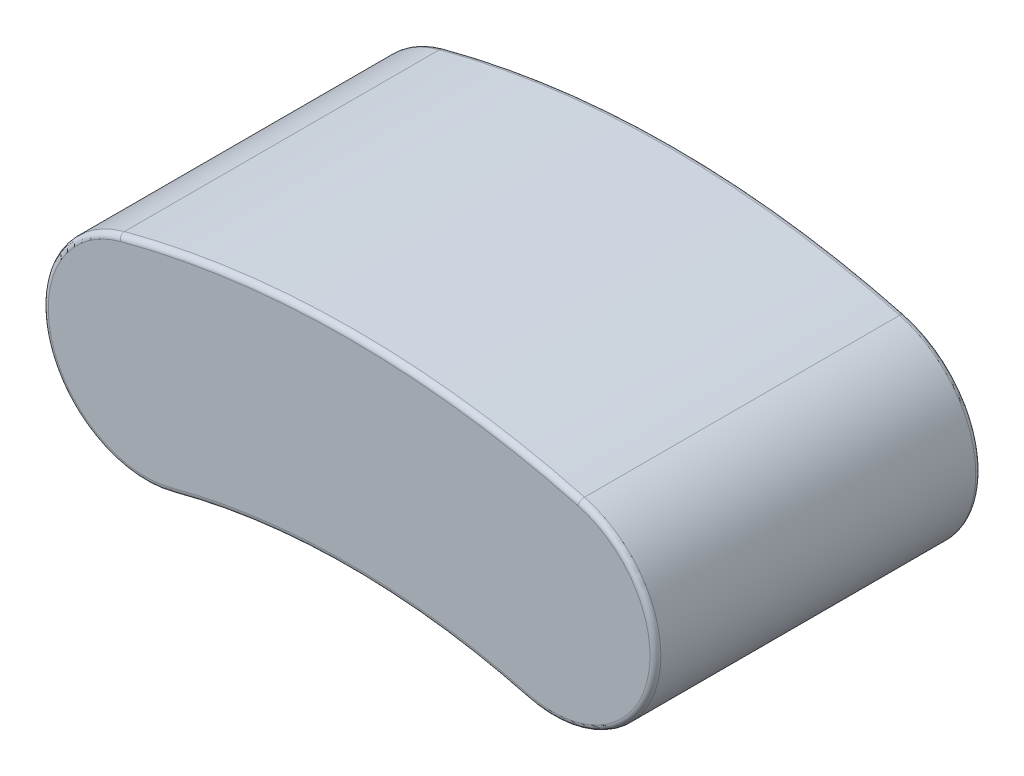
ISO-10303-21;
HEADER;
FILE_DESCRIPTION(('STEP AP214'),'2;1');
FILE_NAME('part.step','',(''),(''),'','','');
FILE_SCHEMA(('AUTOMOTIVE_DESIGN { 1 0 10303 214 1 1 1 1 }'));
ENDSEC;
DATA;
#1=APPLICATION_CONTEXT('core data for automotive mechanical design processes');
#2=APPLICATION_PROTOCOL_DEFINITION('international standard','automotive_design',2000,#1);
#3=PRODUCT_CONTEXT('',#1,'mechanical');
#4=PRODUCT('Part','Part','',(#3));
#5=PRODUCT_RELATED_PRODUCT_CATEGORY('part','',(#4));
#6=PRODUCT_DEFINITION_FORMATION('','',#4);
#7=PRODUCT_DEFINITION_CONTEXT('part definition',#1,'design');
#8=PRODUCT_DEFINITION('design','',#6,#7);
#9=PRODUCT_DEFINITION_SHAPE('','',#8);
#10=(LENGTH_UNIT() NAMED_UNIT(*) SI_UNIT(.MILLI.,.METRE.));
#11=(NAMED_UNIT(*) PLANE_ANGLE_UNIT() SI_UNIT($,.RADIAN.));
#12=(NAMED_UNIT(*) SI_UNIT($,.STERADIAN.) SOLID_ANGLE_UNIT());
#13=UNCERTAINTY_MEASURE_WITH_UNIT(LENGTH_MEASURE(1.E-05),#10,'distance_accuracy_value','');
#14=(GEOMETRIC_REPRESENTATION_CONTEXT(3) GLOBAL_UNCERTAINTY_ASSIGNED_CONTEXT((#13)) GLOBAL_UNIT_ASSIGNED_CONTEXT((#10,
#11,#12)) REPRESENTATION_CONTEXT('',''));
#15=CARTESIAN_POINT('',(0.,0.,0.));
#16=DIRECTION('',(0.,0.,1.));
#17=DIRECTION('',(1.,0.,0.));
#18=AXIS2_PLACEMENT_3D('',#15,#16,#17);
#19=CARTESIAN_POINT('',(37.5,-150.648630181845,0.));
#20=DIRECTION('',(0.,0.,1.));
#21=DIRECTION('',(1.,0.,0.));
#22=AXIS2_PLACEMENT_3D('',#19,#20,#21);
#23=PLANE('',#22);
#24=CARTESIAN_POINT('',(0.,-291.483111090051,0.));
#25=DIRECTION('',(0.,0.,1.));
#26=DIRECTION('',(1.,0.,0.));
#27=AXIS2_PLACEMENT_3D('',#24,#25,#26);
#28=CIRCLE('',#27,327.312940209081);
#29=CARTESIAN_POINT('',(-84.2191865726898,24.8093002026451,0.));
#30=VERTEX_POINT('',#29);
#31=CARTESIAN_POINT('',(84.2191865726898,24.8093002026452,0.));
#32=VERTEX_POINT('',#31);
#33=EDGE_CURVE('E203',#30,#32,#28,.F.);
#34=ORIENTED_EDGE('',*,*,#33,.T.);
#35=CARTESIAN_POINT('',(75.,-9.81414927363925,0.));
#36=DIRECTION('',(0.,0.,1.));
#37=DIRECTION('',(1.,0.,0.));
#38=AXIS2_PLACEMENT_3D('',#35,#36,#37);
#39=CIRCLE('',#38,35.8298291190299);
#40=CARTESIAN_POINT('',(65.7808134273102,-44.4375987499236,0.));
#41=VERTEX_POINT('',#40);
#42=EDGE_CURVE('E209',#32,#41,#39,.F.);
#43=ORIENTED_EDGE('',*,*,#42,.T.);
#44=CARTESIAN_POINT('',(0.,-291.483111090051,0.));
#45=DIRECTION('',(0.,0.,1.));
#46=DIRECTION('',(1.,0.,0.));
#47=AXIS2_PLACEMENT_3D('',#44,#45,#46);
#48=CIRCLE('',#47,255.653281971021);
#49=CARTESIAN_POINT('',(-65.7808134273102,-44.4375987499237,0.));
#50=VERTEX_POINT('',#49);
#51=EDGE_CURVE('E207',#41,#50,#48,.T.);
#52=ORIENTED_EDGE('',*,*,#51,.T.);
#53=CARTESIAN_POINT('',(-75.,-9.81414927363925,0.));
#54=DIRECTION('',(0.,0.,1.));
#55=DIRECTION('',(1.,0.,0.));
#56=AXIS2_PLACEMENT_3D('',#53,#54,#55);
#57=CIRCLE('',#56,35.8298291190299);
#58=EDGE_CURVE('E205',#50,#30,#57,.F.);
#59=ORIENTED_EDGE('',*,*,#58,.T.);
#60=EDGE_LOOP('',(#34,#43,#52,#59));
#61=FACE_BOUND('',#60,.T.);
#62=CARTESIAN_POINT('',(75.,-9.81414927363925,0.));
#63=DIRECTION('',(0.,0.,1.));
#64=DIRECTION('',(1.,0.,0.));
#65=AXIS2_PLACEMENT_3D('',#62,#63,#64);
#66=CIRCLE('',#65,34.8298291190299);
#67=CARTESIAN_POINT('',(83.9618817850487,23.8429699039083,0.));
#68=VERTEX_POINT('',#67);
#69=CARTESIAN_POINT('',(66.0381182149514,-43.4712684511867,0.));
#70=VERTEX_POINT('',#69);
#71=EDGE_CURVE('E134',#68,#70,#66,.F.);
#72=ORIENTED_EDGE('',*,*,#71,.F.);
#73=CARTESIAN_POINT('',(0.,-291.483111090051,0.));
#74=DIRECTION('',(0.,0.,1.));
#75=DIRECTION('',(1.,0.,0.));
#76=AXIS2_PLACEMENT_3D('',#73,#74,#75);
#77=CIRCLE('',#76,326.312940209081);
#78=CARTESIAN_POINT('',(-83.9618817850486,23.8429699039082,0.));
#79=VERTEX_POINT('',#78);
#80=EDGE_CURVE('E150',#68,#79,#77,.T.);
#81=ORIENTED_EDGE('',*,*,#80,.T.);
#82=CARTESIAN_POINT('',(-75.,-9.81414927363925,0.));
#83=DIRECTION('',(0.,0.,1.));
#84=DIRECTION('',(1.,0.,0.));
#85=AXIS2_PLACEMENT_3D('',#82,#83,#84);
#86=CIRCLE('',#85,34.8298291190299);
#87=CARTESIAN_POINT('',(-66.0381182149514,-43.4712684511867,0.));
#88=VERTEX_POINT('',#87);
#89=EDGE_CURVE('E157',#88,#79,#86,.F.);
#90=ORIENTED_EDGE('',*,*,#89,.F.);
#91=CARTESIAN_POINT('',(0.,-291.483111090051,0.));
#92=DIRECTION('',(0.,0.,1.));
#93=DIRECTION('',(1.,0.,0.));
#94=AXIS2_PLACEMENT_3D('',#91,#92,#93);
#95=CIRCLE('',#94,256.653281971021);
#96=EDGE_CURVE('E155',#70,#88,#95,.T.);
#97=ORIENTED_EDGE('',*,*,#96,.F.);
#98=EDGE_LOOP('',(#72,#81,#90,#97));
#99=FACE_BOUND('',#98,.T.);
#100=ADVANCED_FACE('F37',(#61,#99),#23,.F.);
#101=CARTESIAN_POINT('',(75.,-9.81414927363925,120.));
#102=DIRECTION('',(0.,0.,-1.));
#103=DIRECTION('',(-1.,0.,0.));
#104=AXIS2_PLACEMENT_3D('',#101,#102,#103);
#105=CYLINDRICAL_SURFACE('',#104,37.8298291190299);
#106=DIRECTION('',(0.,0.,-1.));
#107=VECTOR('',#106,1.);
#108=CARTESIAN_POINT('',(65.266203852028,-46.3702593473974,120.));
#109=LINE('',#108,#107);
#110=CARTESIAN_POINT('',(65.266203852028,-46.3702593473974,118.));
#111=VERTEX_POINT('',#110);
#112=CARTESIAN_POINT('',(65.266203852028,-46.3702593473974,2.));
#113=VERTEX_POINT('',#112);
#114=EDGE_CURVE('E162',#111,#113,#109,.T.);
#115=ORIENTED_EDGE('',*,*,#114,.T.);
#116=CARTESIAN_POINT('',(75.,-9.81414927363925,2.));
#117=DIRECTION('',(0.,0.,1.));
#118=DIRECTION('',(1.,0.,0.));
#119=AXIS2_PLACEMENT_3D('',#116,#117,#118);
#120=CIRCLE('',#119,37.8298291190299);
#121=CARTESIAN_POINT('',(84.733796147972,26.741960800119,2.));
#122=VERTEX_POINT('',#121);
#123=EDGE_CURVE('E191',#113,#122,#120,.T.);
#124=ORIENTED_EDGE('',*,*,#123,.T.);
#125=DIRECTION('',(0.,0.,-1.));
#126=VECTOR('',#125,1.);
#127=CARTESIAN_POINT('',(84.733796147972,26.741960800119,120.));
#128=LINE('',#127,#126);
#129=CARTESIAN_POINT('',(84.733796147972,26.741960800119,118.));
#130=VERTEX_POINT('',#129);
#131=EDGE_CURVE('E171',#130,#122,#128,.T.);
#132=ORIENTED_EDGE('',*,*,#131,.F.);
#133=CARTESIAN_POINT('',(75.,-9.81414927363925,118.));
#134=DIRECTION('',(0.,0.,1.));
#135=DIRECTION('',(1.,0.,0.));
#136=AXIS2_PLACEMENT_3D('',#133,#134,#135);
#137=CIRCLE('',#136,37.8298291190299);
#138=EDGE_CURVE('E182',#130,#111,#137,.F.);
#139=ORIENTED_EDGE('',*,*,#138,.T.);
#140=EDGE_LOOP('',(#115,#124,#132,#139));
#141=FACE_BOUND('',#140,.T.);
#142=ADVANCED_FACE('F242',(#141),#105,.T.);
#143=CARTESIAN_POINT('',(0.,-291.483111090051,120.));
#144=DIRECTION('',(0.,0.,-1.));
#145=DIRECTION('',(-1.,0.,0.));
#146=AXIS2_PLACEMENT_3D('',#143,#144,#145);
#147=CYLINDRICAL_SURFACE('',#146,329.312940209081);
#148=ORIENTED_EDGE('',*,*,#131,.T.);
#149=CARTESIAN_POINT('',(0.,-291.483111090051,2.));
#150=DIRECTION('',(0.,0.,1.));
#151=DIRECTION('',(1.,0.,0.));
#152=AXIS2_PLACEMENT_3D('',#149,#150,#151);
#153=CIRCLE('',#152,329.312940209081);
#154=CARTESIAN_POINT('',(-84.733796147972,26.741960800119,2.));
#155=VERTEX_POINT('',#154);
#156=EDGE_CURVE('E11',#122,#155,#153,.T.);
#157=ORIENTED_EDGE('',*,*,#156,.T.);
#158=DIRECTION('',(0.,0.,-1.));
#159=VECTOR('',#158,1.);
#160=CARTESIAN_POINT('',(-84.733796147972,26.741960800119,120.));
#161=LINE('',#160,#159);
#162=CARTESIAN_POINT('',(-84.733796147972,26.741960800119,118.));
#163=VERTEX_POINT('',#162);
#164=EDGE_CURVE('E169',#163,#155,#161,.T.);
#165=ORIENTED_EDGE('',*,*,#164,.F.);
#166=CARTESIAN_POINT('',(0.,-291.483111090051,118.));
#167=DIRECTION('',(0.,0.,1.));
#168=DIRECTION('',(1.,0.,0.));
#169=AXIS2_PLACEMENT_3D('',#166,#167,#168);
#170=CIRCLE('',#169,329.312940209081);
#171=EDGE_CURVE('E189',#163,#130,#170,.F.);
#172=ORIENTED_EDGE('',*,*,#171,.T.);
#173=EDGE_LOOP('',(#148,#157,#165,#172));
#174=FACE_BOUND('',#173,.T.);
#175=ADVANCED_FACE('F245',(#174),#147,.T.);
#176=CARTESIAN_POINT('',(-75.,-9.81414927363925,120.));
#177=DIRECTION('',(0.,0.,-1.));
#178=DIRECTION('',(-1.,0.,0.));
#179=AXIS2_PLACEMENT_3D('',#176,#177,#178);
#180=CYLINDRICAL_SURFACE('',#179,37.8298291190299);
#181=ORIENTED_EDGE('',*,*,#164,.T.);
#182=CARTESIAN_POINT('',(-75.,-9.81414927363925,2.));
#183=DIRECTION('',(0.,0.,1.));
#184=DIRECTION('',(1.,0.,0.));
#185=AXIS2_PLACEMENT_3D('',#182,#183,#184);
#186=CIRCLE('',#185,37.8298291190299);
#187=CARTESIAN_POINT('',(-65.266203852028,-46.3702593473975,2.));
#188=VERTEX_POINT('',#187);
#189=EDGE_CURVE('E46',#155,#188,#186,.T.);
#190=ORIENTED_EDGE('',*,*,#189,.T.);
#191=DIRECTION('',(0.,0.,-1.));
#192=VECTOR('',#191,1.);
#193=CARTESIAN_POINT('',(-65.266203852028,-46.3702593473975,120.));
#194=LINE('',#193,#192);
#195=CARTESIAN_POINT('',(-65.266203852028,-46.3702593473975,118.));
#196=VERTEX_POINT('',#195);
#197=EDGE_CURVE('E165',#196,#188,#194,.T.);
#198=ORIENTED_EDGE('',*,*,#197,.F.);
#199=CARTESIAN_POINT('',(-75.,-9.81414927363925,118.));
#200=DIRECTION('',(0.,0.,1.));
#201=DIRECTION('',(1.,0.,0.));
#202=AXIS2_PLACEMENT_3D('',#199,#200,#201);
#203=CIRCLE('',#202,37.8298291190299);
#204=EDGE_CURVE('E187',#196,#163,#203,.F.);
#205=ORIENTED_EDGE('',*,*,#204,.T.);
#206=EDGE_LOOP('',(#181,#190,#198,#205));
#207=FACE_BOUND('',#206,.T.);
#208=ADVANCED_FACE('F262',(#207),#180,.T.);
#209=CARTESIAN_POINT('',(0.,-291.483111090051,120.));
#210=DIRECTION('',(0.,0.,-1.));
#211=DIRECTION('',(-1.,0.,0.));
#212=AXIS2_PLACEMENT_3D('',#209,#210,#211);
#213=CYLINDRICAL_SURFACE('',#212,253.653281971021);
#214=ORIENTED_EDGE('',*,*,#197,.T.);
#215=CARTESIAN_POINT('',(0.,-291.483111090051,2.));
#216=DIRECTION('',(0.,0.,1.));
#217=DIRECTION('',(1.,0.,0.));
#218=AXIS2_PLACEMENT_3D('',#215,#216,#217);
#219=CIRCLE('',#218,253.653281971021);
#220=EDGE_CURVE('E212',#188,#113,#219,.F.);
#221=ORIENTED_EDGE('',*,*,#220,.T.);
#222=ORIENTED_EDGE('',*,*,#114,.F.);
#223=CARTESIAN_POINT('',(0.,-291.483111090051,118.));
#224=DIRECTION('',(0.,0.,1.));
#225=DIRECTION('',(1.,0.,0.));
#226=AXIS2_PLACEMENT_3D('',#223,#224,#225);
#227=CIRCLE('',#226,253.653281971021);
#228=EDGE_CURVE('E185',#111,#196,#227,.T.);
#229=ORIENTED_EDGE('',*,*,#228,.T.);
#230=EDGE_LOOP('',(#214,#221,#222,#229));
#231=FACE_BOUND('',#230,.T.);
#232=ADVANCED_FACE('F258',(#231),#213,.F.);
#233=CARTESIAN_POINT('',(37.5,-150.648630181845,120.));
#234=DIRECTION('',(0.,0.,1.));
#235=DIRECTION('',(1.,0.,0.));
#236=AXIS2_PLACEMENT_3D('',#233,#234,#235);
#237=PLANE('',#236);
#238=CARTESIAN_POINT('',(0.,-291.483111090051,120.));
#239=DIRECTION('',(0.,0.,1.));
#240=DIRECTION('',(1.,0.,0.));
#241=AXIS2_PLACEMENT_3D('',#238,#239,#240);
#242=CIRCLE('',#241,255.653281971021);
#243=CARTESIAN_POINT('',(-65.7808134273102,-44.4375987499237,120.));
#244=VERTEX_POINT('',#243);
#245=CARTESIAN_POINT('',(65.7808134273102,-44.4375987499236,120.));
#246=VERTEX_POINT('',#245);
#247=EDGE_CURVE('E177',#244,#246,#242,.F.);
#248=ORIENTED_EDGE('',*,*,#247,.T.);
#249=CARTESIAN_POINT('',(75.,-9.81414927363925,120.));
#250=DIRECTION('',(0.,0.,1.));
#251=DIRECTION('',(1.,0.,0.));
#252=AXIS2_PLACEMENT_3D('',#249,#250,#251);
#253=CIRCLE('',#252,35.8298291190299);
#254=CARTESIAN_POINT('',(84.2191865726898,24.8093002026452,120.));
#255=VERTEX_POINT('',#254);
#256=EDGE_CURVE('E179',#246,#255,#253,.T.);
#257=ORIENTED_EDGE('',*,*,#256,.T.);
#258=CARTESIAN_POINT('',(0.,-291.483111090051,120.));
#259=DIRECTION('',(0.,0.,1.));
#260=DIRECTION('',(1.,0.,0.));
#261=AXIS2_PLACEMENT_3D('',#258,#259,#260);
#262=CIRCLE('',#261,327.312940209081);
#263=CARTESIAN_POINT('',(-84.2191865726898,24.8093002026451,120.));
#264=VERTEX_POINT('',#263);
#265=EDGE_CURVE('E173',#255,#264,#262,.T.);
#266=ORIENTED_EDGE('',*,*,#265,.T.);
#267=CARTESIAN_POINT('',(-75.,-9.81414927363925,120.));
#268=DIRECTION('',(0.,0.,1.));
#269=DIRECTION('',(1.,0.,0.));
#270=AXIS2_PLACEMENT_3D('',#267,#268,#269);
#271=CIRCLE('',#270,35.8298291190299);
#272=EDGE_CURVE('E175',#264,#244,#271,.T.);
#273=ORIENTED_EDGE('',*,*,#272,.T.);
#274=EDGE_LOOP('',(#248,#257,#266,#273));
#275=FACE_BOUND('',#274,.T.);
#276=ADVANCED_FACE('F271',(#275),#237,.T.);
#277=CARTESIAN_POINT('',(-75.,-9.81414927363925,118.));
#278=DIRECTION('',(0.,0.,1.));
#279=DIRECTION('',(1.,0.,0.));
#280=AXIS2_PLACEMENT_3D('',#277,#278,#279);
#281=TOROIDAL_SURFACE('',#280,35.8298291190299,2.);
#282=CARTESIAN_POINT('',(-84.2191865726898,24.8093002026452,118.));
#283=DIRECTION('',(0.966330298736904,0.257304787641126,0.));
#284=DIRECTION('',(-0.257304787641126,0.966330298736905,0.));
#285=AXIS2_PLACEMENT_3D('',#282,#283,#284);
#286=CIRCLE('',#285,2.);
#287=EDGE_CURVE('E196',#163,#264,#286,.T.);
#288=ORIENTED_EDGE('',*,*,#287,.F.);
#289=ORIENTED_EDGE('',*,*,#204,.F.);
#290=CARTESIAN_POINT('',(-65.7808134273102,-44.4375987499237,118.));
#291=DIRECTION('',(0.966330298736905,0.257304787641125,0.));
#292=DIRECTION('',(-0.257304787641125,0.966330298736905,0.));
#293=AXIS2_PLACEMENT_3D('',#290,#291,#292);
#294=CIRCLE('',#293,2.);
#295=EDGE_CURVE('E166',#244,#196,#294,.T.);
#296=ORIENTED_EDGE('',*,*,#295,.F.);
#297=ORIENTED_EDGE('',*,*,#272,.F.);
#298=EDGE_LOOP('',(#288,#289,#296,#297));
#299=FACE_BOUND('',#298,.T.);
#300=ADVANCED_FACE('F265',(#299),#281,.T.);
#301=CARTESIAN_POINT('',(0.,-291.483111090051,118.));
#302=DIRECTION('',(0.,0.,1.));
#303=DIRECTION('',(1.,0.,0.));
#304=AXIS2_PLACEMENT_3D('',#301,#302,#303);
#305=TOROIDAL_SURFACE('',#304,255.653281971021,2.);
#306=ORIENTED_EDGE('',*,*,#295,.T.);
#307=ORIENTED_EDGE('',*,*,#228,.F.);
#308=CARTESIAN_POINT('',(65.7808134273102,-44.4375987499236,118.));
#309=DIRECTION('',(0.966330298736905,-0.257304787641125,0.));
#310=DIRECTION('',(0.257304787641125,0.966330298736905,0.));
#311=AXIS2_PLACEMENT_3D('',#308,#309,#310);
#312=CIRCLE('',#311,2.);
#313=EDGE_CURVE('E194',#246,#111,#312,.T.);
#314=ORIENTED_EDGE('',*,*,#313,.F.);
#315=ORIENTED_EDGE('',*,*,#247,.F.);
#316=EDGE_LOOP('',(#306,#307,#314,#315));
#317=FACE_BOUND('',#316,.T.);
#318=ADVANCED_FACE('F269',(#317),#305,.T.);
#319=CARTESIAN_POINT('',(0.,-291.483111090051,118.));
#320=DIRECTION('',(0.,0.,1.));
#321=DIRECTION('',(1.,0.,0.));
#322=AXIS2_PLACEMENT_3D('',#319,#320,#321);
#323=TOROIDAL_SURFACE('',#322,327.312940209081,2.);
#324=ORIENTED_EDGE('',*,*,#287,.T.);
#325=ORIENTED_EDGE('',*,*,#265,.F.);
#326=CARTESIAN_POINT('',(84.2191865726898,24.8093002026452,118.));
#327=DIRECTION('',(0.966330298736904,-0.257304787641126,0.));
#328=DIRECTION('',(0.257304787641126,0.966330298736905,0.));
#329=AXIS2_PLACEMENT_3D('',#326,#327,#328);
#330=CIRCLE('',#329,2.);
#331=EDGE_CURVE('E192',#130,#255,#330,.T.);
#332=ORIENTED_EDGE('',*,*,#331,.F.);
#333=ORIENTED_EDGE('',*,*,#171,.F.);
#334=EDGE_LOOP('',(#324,#325,#332,#333));
#335=FACE_BOUND('',#334,.T.);
#336=ADVANCED_FACE('F250',(#335),#323,.T.);
#337=CARTESIAN_POINT('',(75.,-9.81414927363925,118.));
#338=DIRECTION('',(0.,0.,1.));
#339=DIRECTION('',(1.,0.,0.));
#340=AXIS2_PLACEMENT_3D('',#337,#338,#339);
#341=TOROIDAL_SURFACE('',#340,35.8298291190299,2.);
#342=ORIENTED_EDGE('',*,*,#313,.T.);
#343=ORIENTED_EDGE('',*,*,#138,.F.);
#344=ORIENTED_EDGE('',*,*,#331,.T.);
#345=ORIENTED_EDGE('',*,*,#256,.F.);
#346=EDGE_LOOP('',(#342,#343,#344,#345));
#347=FACE_BOUND('',#346,.T.);
#348=ADVANCED_FACE('F254',(#347),#341,.T.);
#349=CARTESIAN_POINT('',(-75.,-9.81414927363925,2.));
#350=DIRECTION('',(0.,0.,1.));
#351=DIRECTION('',(1.,0.,0.));
#352=AXIS2_PLACEMENT_3D('',#349,#350,#351);
#353=TOROIDAL_SURFACE('',#352,35.8298291190299,2.);
#354=CARTESIAN_POINT('',(-84.2191865726898,24.8093002026451,2.));
#355=DIRECTION('',(0.966330298736905,0.257304787641125,0.));
#356=DIRECTION('',(-0.257304787641125,0.966330298736905,0.));
#357=AXIS2_PLACEMENT_3D('',#354,#355,#356);
#358=CIRCLE('',#357,2.);
#359=EDGE_CURVE('E217',#30,#155,#358,.T.);
#360=ORIENTED_EDGE('',*,*,#359,.F.);
#361=ORIENTED_EDGE('',*,*,#58,.F.);
#362=CARTESIAN_POINT('',(-65.7808134273102,-44.4375987499237,2.));
#363=DIRECTION('',(0.966330298736904,0.257304787641126,0.));
#364=DIRECTION('',(-0.257304787641126,0.966330298736905,0.));
#365=AXIS2_PLACEMENT_3D('',#362,#363,#364);
#366=CIRCLE('',#365,2.);
#367=EDGE_CURVE('E41',#188,#50,#366,.T.);
#368=ORIENTED_EDGE('',*,*,#367,.F.);
#369=ORIENTED_EDGE('',*,*,#189,.F.);
#370=EDGE_LOOP('',(#360,#361,#368,#369));
#371=FACE_BOUND('',#370,.T.);
#372=ADVANCED_FACE('F39',(#371),#353,.T.);
#373=CARTESIAN_POINT('',(0.,-291.483111090051,2.));
#374=DIRECTION('',(0.,0.,1.));
#375=DIRECTION('',(1.,0.,0.));
#376=AXIS2_PLACEMENT_3D('',#373,#374,#375);
#377=TOROIDAL_SURFACE('',#376,255.653281971021,2.);
#378=ORIENTED_EDGE('',*,*,#367,.T.);
#379=ORIENTED_EDGE('',*,*,#51,.F.);
#380=CARTESIAN_POINT('',(65.7808134273102,-44.4375987499236,2.));
#381=DIRECTION('',(0.966330298736904,-0.257304787641126,0.));
#382=DIRECTION('',(0.257304787641126,0.966330298736905,0.));
#383=AXIS2_PLACEMENT_3D('',#380,#381,#382);
#384=CIRCLE('',#383,2.);
#385=EDGE_CURVE('E216',#113,#41,#384,.T.);
#386=ORIENTED_EDGE('',*,*,#385,.F.);
#387=ORIENTED_EDGE('',*,*,#220,.F.);
#388=EDGE_LOOP('',(#378,#379,#386,#387));
#389=FACE_BOUND('',#388,.T.);
#390=ADVANCED_FACE('F227',(#389),#377,.T.);
#391=CARTESIAN_POINT('',(0.,-291.483111090051,2.));
#392=DIRECTION('',(0.,0.,1.));
#393=DIRECTION('',(1.,0.,0.));
#394=AXIS2_PLACEMENT_3D('',#391,#392,#393);
#395=TOROIDAL_SURFACE('',#394,327.312940209081,2.);
#396=ORIENTED_EDGE('',*,*,#359,.T.);
#397=ORIENTED_EDGE('',*,*,#156,.F.);
#398=CARTESIAN_POINT('',(84.2191865726898,24.8093002026452,2.));
#399=DIRECTION('',(0.966330298736905,-0.257304787641126,0.));
#400=DIRECTION('',(0.257304787641126,0.966330298736905,0.));
#401=AXIS2_PLACEMENT_3D('',#398,#399,#400);
#402=CIRCLE('',#401,2.);
#403=EDGE_CURVE('E159',#32,#122,#402,.T.);
#404=ORIENTED_EDGE('',*,*,#403,.F.);
#405=ORIENTED_EDGE('',*,*,#33,.F.);
#406=EDGE_LOOP('',(#396,#397,#404,#405));
#407=FACE_BOUND('',#406,.T.);
#408=ADVANCED_FACE('F239',(#407),#395,.T.);
#409=CARTESIAN_POINT('',(75.,-9.81414927363925,2.));
#410=DIRECTION('',(0.,0.,1.));
#411=DIRECTION('',(1.,0.,0.));
#412=AXIS2_PLACEMENT_3D('',#409,#410,#411);
#413=TOROIDAL_SURFACE('',#412,35.8298291190299,2.);
#414=ORIENTED_EDGE('',*,*,#385,.T.);
#415=ORIENTED_EDGE('',*,*,#42,.F.);
#416=ORIENTED_EDGE('',*,*,#403,.T.);
#417=ORIENTED_EDGE('',*,*,#123,.F.);
#418=EDGE_LOOP('',(#414,#415,#416,#417));
#419=FACE_BOUND('',#418,.T.);
#420=ADVANCED_FACE('F237',(#419),#413,.T.);
#421=CARTESIAN_POINT('',(75.,-9.81414927363925,120.));
#422=DIRECTION('',(0.,0.,-1.));
#423=DIRECTION('',(-1.,0.,0.));
#424=AXIS2_PLACEMENT_3D('',#421,#422,#423);
#425=CYLINDRICAL_SURFACE('',#424,34.8298291190299);
#426=DIRECTION('',(0.,0.,-1.));
#427=VECTOR('',#426,1.);
#428=CARTESIAN_POINT('',(66.0381182149514,-43.4712684511867,120.));
#429=LINE('',#428,#427);
#430=CARTESIAN_POINT('',(66.0381182149514,-43.4712684511867,117.));
#431=VERTEX_POINT('',#430);
#432=EDGE_CURVE('E128',#431,#70,#429,.T.);
#433=ORIENTED_EDGE('',*,*,#432,.F.);
#434=CARTESIAN_POINT('',(75.,-9.81414927363925,117.));
#435=DIRECTION('',(0.,0.,1.));
#436=DIRECTION('',(1.,0.,0.));
#437=AXIS2_PLACEMENT_3D('',#434,#435,#436);
#438=CIRCLE('',#437,34.8298291190299);
#439=CARTESIAN_POINT('',(83.9618817850487,23.8429699039083,117.));
#440=VERTEX_POINT('',#439);
#441=EDGE_CURVE('E131',#440,#431,#438,.F.);
#442=ORIENTED_EDGE('',*,*,#441,.F.);
#443=DIRECTION('',(0.,0.,-1.));
#444=VECTOR('',#443,1.);
#445=CARTESIAN_POINT('',(83.9618817850487,23.8429699039083,120.));
#446=LINE('',#445,#444);
#447=EDGE_CURVE('E429',#440,#68,#446,.T.);
#448=ORIENTED_EDGE('',*,*,#447,.T.);
#449=ORIENTED_EDGE('',*,*,#71,.T.);
#450=EDGE_LOOP('',(#433,#442,#448,#449));
#451=FACE_BOUND('',#450,.T.);
#452=ADVANCED_FACE('F130',(#451),#425,.F.);
#453=CARTESIAN_POINT('',(0.,-291.483111090051,120.));
#454=DIRECTION('',(0.,0.,-1.));
#455=DIRECTION('',(-1.,0.,0.));
#456=AXIS2_PLACEMENT_3D('',#453,#454,#455);
#457=CYLINDRICAL_SURFACE('',#456,326.312940209081);
#458=ORIENTED_EDGE('',*,*,#447,.F.);
#459=CARTESIAN_POINT('',(0.,-291.483111090051,117.));
#460=DIRECTION('',(0.,0.,1.));
#461=DIRECTION('',(1.,0.,0.));
#462=AXIS2_PLACEMENT_3D('',#459,#460,#461);
#463=CIRCLE('',#462,326.312940209081);
#464=CARTESIAN_POINT('',(-83.9618817850486,23.8429699039082,117.));
#465=VERTEX_POINT('',#464);
#466=EDGE_CURVE('E144',#440,#465,#463,.T.);
#467=ORIENTED_EDGE('',*,*,#466,.T.);
#468=DIRECTION('',(0.,0.,-1.));
#469=VECTOR('',#468,1.);
#470=CARTESIAN_POINT('',(-83.9618817850486,23.8429699039082,120.));
#471=LINE('',#470,#469);
#472=EDGE_CURVE('E426',#465,#79,#471,.T.);
#473=ORIENTED_EDGE('',*,*,#472,.T.);
#474=ORIENTED_EDGE('',*,*,#80,.F.);
#475=EDGE_LOOP('',(#458,#467,#473,#474));
#476=FACE_BOUND('',#475,.T.);
#477=ADVANCED_FACE('F387',(#476),#457,.F.);
#478=CARTESIAN_POINT('',(-75.,-9.81414927363925,120.));
#479=DIRECTION('',(0.,0.,-1.));
#480=DIRECTION('',(-1.,0.,0.));
#481=AXIS2_PLACEMENT_3D('',#478,#479,#480);
#482=CYLINDRICAL_SURFACE('',#481,34.8298291190299);
#483=ORIENTED_EDGE('',*,*,#472,.F.);
#484=CARTESIAN_POINT('',(-75.,-9.81414927363925,117.));
#485=DIRECTION('',(0.,0.,1.));
#486=DIRECTION('',(1.,0.,0.));
#487=AXIS2_PLACEMENT_3D('',#484,#485,#486);
#488=CIRCLE('',#487,34.8298291190299);
#489=CARTESIAN_POINT('',(-66.0381182149514,-43.4712684511867,117.));
#490=VERTEX_POINT('',#489);
#491=EDGE_CURVE('E148',#490,#465,#488,.F.);
#492=ORIENTED_EDGE('',*,*,#491,.F.);
#493=DIRECTION('',(0.,0.,-1.));
#494=VECTOR('',#493,1.);
#495=CARTESIAN_POINT('',(-66.0381182149514,-43.4712684511867,120.));
#496=LINE('',#495,#494);
#497=EDGE_CURVE('E54',#490,#88,#496,.T.);
#498=ORIENTED_EDGE('',*,*,#497,.T.);
#499=ORIENTED_EDGE('',*,*,#89,.T.);
#500=EDGE_LOOP('',(#483,#492,#498,#499));
#501=FACE_BOUND('',#500,.T.);
#502=ADVANCED_FACE('F395',(#501),#482,.F.);
#503=CARTESIAN_POINT('',(0.,-291.483111090051,120.));
#504=DIRECTION('',(0.,0.,-1.));
#505=DIRECTION('',(-1.,0.,0.));
#506=AXIS2_PLACEMENT_3D('',#503,#504,#505);
#507=CYLINDRICAL_SURFACE('',#506,256.653281971021);
#508=ORIENTED_EDGE('',*,*,#497,.F.);
#509=CARTESIAN_POINT('',(0.,-291.483111090051,117.));
#510=DIRECTION('',(0.,0.,1.));
#511=DIRECTION('',(1.,0.,0.));
#512=AXIS2_PLACEMENT_3D('',#509,#510,#511);
#513=CIRCLE('',#512,256.653281971021);
#514=EDGE_CURVE('E143',#431,#490,#513,.T.);
#515=ORIENTED_EDGE('',*,*,#514,.F.);
#516=ORIENTED_EDGE('',*,*,#432,.T.);
#517=ORIENTED_EDGE('',*,*,#96,.T.);
#518=EDGE_LOOP('',(#508,#515,#516,#517));
#519=FACE_BOUND('',#518,.T.);
#520=ADVANCED_FACE('F147',(#519),#507,.T.);
#521=CARTESIAN_POINT('',(37.5,-150.648630181845,117.));
#522=DIRECTION('',(0.,0.,1.));
#523=DIRECTION('',(1.,0.,0.));
#524=AXIS2_PLACEMENT_3D('',#521,#522,#523);
#525=PLANE('',#524);
#526=ORIENTED_EDGE('',*,*,#514,.T.);
#527=ORIENTED_EDGE('',*,*,#491,.T.);
#528=ORIENTED_EDGE('',*,*,#466,.F.);
#529=ORIENTED_EDGE('',*,*,#441,.T.);
#530=EDGE_LOOP('',(#526,#527,#528,#529));
#531=FACE_BOUND('',#530,.T.);
#532=ADVANCED_FACE('F141',(#531),#525,.F.);
#533=CLOSED_SHELL('',(#100,#142,#175,#208,#232,#276,#300,#318,#336,#348,#372,#390,#408,#420,
#452,#477,#502,#520,#532));
#534=MANIFOLD_SOLID_BREP('B2',#533);
#535=ADVANCED_BREP_SHAPE_REPRESENTATION('',(#18,#534),#14);
#536=SHAPE_DEFINITION_REPRESENTATION(#9,#535);
ENDSEC;
END-ISO-10303-21;
